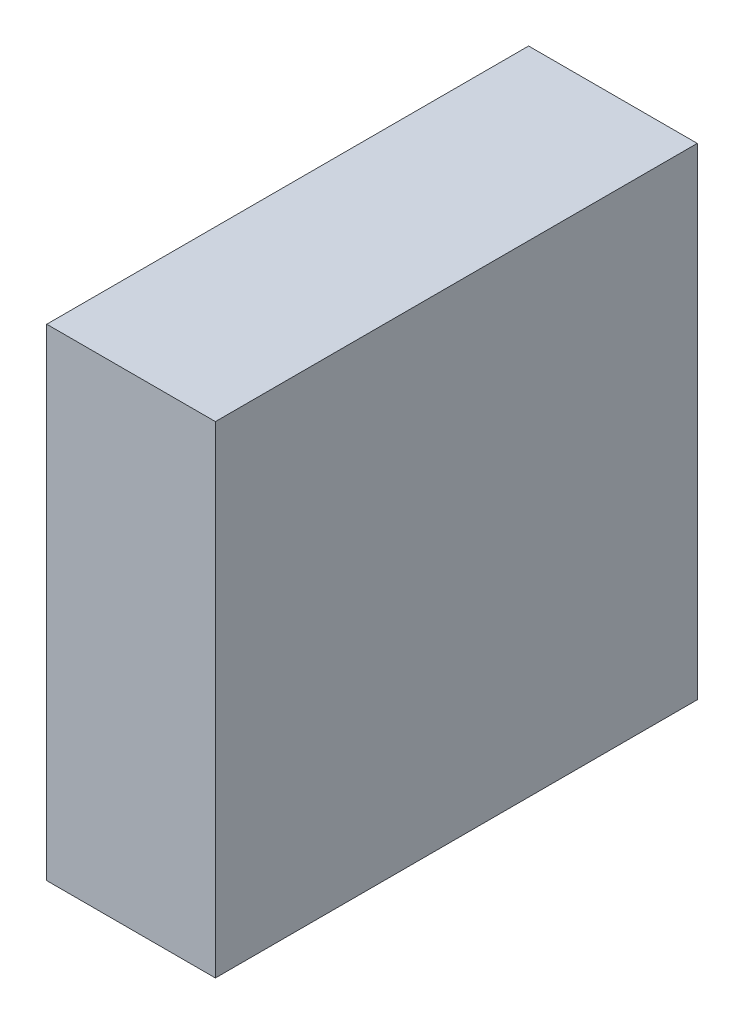
ISO-10303-21;
HEADER;
FILE_DESCRIPTION(('STEP AP214'),'2;1');
FILE_NAME('part.step','',(''),(''),'','','');
FILE_SCHEMA(('AUTOMOTIVE_DESIGN { 1 0 10303 214 1 1 1 1 }'));
ENDSEC;
DATA;
#1=APPLICATION_CONTEXT('core data for automotive mechanical design processes');
#2=APPLICATION_PROTOCOL_DEFINITION('international standard','automotive_design',2000,#1);
#3=PRODUCT_CONTEXT('',#1,'mechanical');
#4=PRODUCT('Part','Part','',(#3));
#5=PRODUCT_RELATED_PRODUCT_CATEGORY('part','',(#4));
#6=PRODUCT_DEFINITION_FORMATION('','',#4);
#7=PRODUCT_DEFINITION_CONTEXT('part definition',#1,'design');
#8=PRODUCT_DEFINITION('design','',#6,#7);
#9=PRODUCT_DEFINITION_SHAPE('','',#8);
#10=(LENGTH_UNIT() NAMED_UNIT(*) SI_UNIT(.MILLI.,.METRE.));
#11=(NAMED_UNIT(*) PLANE_ANGLE_UNIT() SI_UNIT($,.RADIAN.));
#12=(NAMED_UNIT(*) SI_UNIT($,.STERADIAN.) SOLID_ANGLE_UNIT());
#13=UNCERTAINTY_MEASURE_WITH_UNIT(LENGTH_MEASURE(1.E-05),#10,'distance_accuracy_value','');
#14=(GEOMETRIC_REPRESENTATION_CONTEXT(3) GLOBAL_UNCERTAINTY_ASSIGNED_CONTEXT((#13)) GLOBAL_UNIT_ASSIGNED_CONTEXT((#10,
#11,#12)) REPRESENTATION_CONTEXT('',''));
#15=CARTESIAN_POINT('',(0.,0.,0.));
#16=DIRECTION('',(0.,0.,1.));
#17=DIRECTION('',(1.,0.,0.));
#18=AXIS2_PLACEMENT_3D('',#15,#16,#17);
#19=CARTESIAN_POINT('',(88.9,0.,0.));
#20=DIRECTION('',(0.,0.,-1.));
#21=DIRECTION('',(-1.,0.,0.));
#22=AXIS2_PLACEMENT_3D('',#19,#20,#21);
#23=PLANE('',#22);
#24=DIRECTION('',(0.,-1.,0.));
#25=VECTOR('',#24,1.);
#26=CARTESIAN_POINT('',(0.,0.,0.));
#27=LINE('',#26,#25);
#28=CARTESIAN_POINT('',(0.,254.,0.));
#29=VERTEX_POINT('',#28);
#30=CARTESIAN_POINT('',(0.,0.,0.));
#31=VERTEX_POINT('',#30);
#32=EDGE_CURVE('E96',#29,#31,#27,.T.);
#33=ORIENTED_EDGE('',*,*,#32,.T.);
#34=DIRECTION('',(-1.,0.,0.));
#35=VECTOR('',#34,1.);
#36=CARTESIAN_POINT('',(88.9,0.,0.));
#37=LINE('',#36,#35);
#38=CARTESIAN_POINT('',(88.9,0.,0.));
#39=VERTEX_POINT('',#38);
#40=EDGE_CURVE('E11',#39,#31,#37,.T.);
#41=ORIENTED_EDGE('',*,*,#40,.F.);
#42=DIRECTION('',(0.,-1.,0.));
#43=VECTOR('',#42,1.);
#44=CARTESIAN_POINT('',(88.9,0.,0.));
#45=LINE('',#44,#43);
#46=CARTESIAN_POINT('',(88.9,254.,0.));
#47=VERTEX_POINT('',#46);
#48=EDGE_CURVE('E84',#47,#39,#45,.T.);
#49=ORIENTED_EDGE('',*,*,#48,.F.);
#50=DIRECTION('',(-1.,0.,0.));
#51=VECTOR('',#50,1.);
#52=CARTESIAN_POINT('',(88.9,254.,0.));
#53=LINE('',#52,#51);
#54=EDGE_CURVE('E92',#47,#29,#53,.T.);
#55=ORIENTED_EDGE('',*,*,#54,.T.);
#56=EDGE_LOOP('',(#33,#41,#49,#55));
#57=FACE_BOUND('',#56,.T.);
#58=ADVANCED_FACE('F33',(#57),#23,.F.);
#59=CARTESIAN_POINT('',(88.9,0.,0.));
#60=DIRECTION('',(0.,1.,0.));
#61=DIRECTION('',(0.,0.,1.));
#62=AXIS2_PLACEMENT_3D('',#59,#60,#61);
#63=PLANE('',#62);
#64=DIRECTION('',(0.,0.,-1.));
#65=VECTOR('',#64,1.);
#66=CARTESIAN_POINT('',(0.,0.,0.));
#67=LINE('',#66,#65);
#68=CARTESIAN_POINT('',(0.,0.,-254.));
#69=VERTEX_POINT('',#68);
#70=EDGE_CURVE('E88',#31,#69,#67,.T.);
#71=ORIENTED_EDGE('',*,*,#70,.T.);
#72=DIRECTION('',(-1.,0.,0.));
#73=VECTOR('',#72,1.);
#74=CARTESIAN_POINT('',(88.9,0.,-254.));
#75=LINE('',#74,#73);
#76=CARTESIAN_POINT('',(88.9,0.,-254.));
#77=VERTEX_POINT('',#76);
#78=EDGE_CURVE('E41',#77,#69,#75,.T.);
#79=ORIENTED_EDGE('',*,*,#78,.F.);
#80=DIRECTION('',(0.,0.,-1.));
#81=VECTOR('',#80,1.);
#82=CARTESIAN_POINT('',(88.9,0.,0.));
#83=LINE('',#82,#81);
#84=EDGE_CURVE('E79',#39,#77,#83,.T.);
#85=ORIENTED_EDGE('',*,*,#84,.F.);
#86=ORIENTED_EDGE('',*,*,#40,.T.);
#87=EDGE_LOOP('',(#71,#79,#85,#86));
#88=FACE_BOUND('',#87,.T.);
#89=ADVANCED_FACE('F87',(#88),#63,.F.);
#90=CARTESIAN_POINT('',(88.9,0.,-254.));
#91=DIRECTION('',(0.,0.,1.));
#92=DIRECTION('',(1.,0.,0.));
#93=AXIS2_PLACEMENT_3D('',#90,#91,#92);
#94=PLANE('',#93);
#95=DIRECTION('',(0.,1.,0.));
#96=VECTOR('',#95,1.);
#97=CARTESIAN_POINT('',(0.,0.,-254.));
#98=LINE('',#97,#96);
#99=CARTESIAN_POINT('',(0.,254.,-254.));
#100=VERTEX_POINT('',#99);
#101=EDGE_CURVE('E66',#69,#100,#98,.T.);
#102=ORIENTED_EDGE('',*,*,#101,.T.);
#103=DIRECTION('',(-1.,0.,0.));
#104=VECTOR('',#103,1.);
#105=CARTESIAN_POINT('',(88.9,254.,-254.));
#106=LINE('',#105,#104);
#107=CARTESIAN_POINT('',(88.9,254.,-254.));
#108=VERTEX_POINT('',#107);
#109=EDGE_CURVE('E89',#108,#100,#106,.T.);
#110=ORIENTED_EDGE('',*,*,#109,.F.);
#111=DIRECTION('',(0.,1.,0.));
#112=VECTOR('',#111,1.);
#113=CARTESIAN_POINT('',(88.9,0.,-254.));
#114=LINE('',#113,#112);
#115=EDGE_CURVE('E82',#77,#108,#114,.T.);
#116=ORIENTED_EDGE('',*,*,#115,.F.);
#117=ORIENTED_EDGE('',*,*,#78,.T.);
#118=EDGE_LOOP('',(#102,#110,#116,#117));
#119=FACE_BOUND('',#118,.T.);
#120=ADVANCED_FACE('F90',(#119),#94,.F.);
#121=CARTESIAN_POINT('',(88.9,254.,0.));
#122=DIRECTION('',(0.,-1.,0.));
#123=DIRECTION('',(0.,0.,-1.));
#124=AXIS2_PLACEMENT_3D('',#121,#122,#123);
#125=PLANE('',#124);
#126=DIRECTION('',(0.,0.,1.));
#127=VECTOR('',#126,1.);
#128=CARTESIAN_POINT('',(0.,254.,0.));
#129=LINE('',#128,#127);
#130=EDGE_CURVE('E72',#100,#29,#129,.T.);
#131=ORIENTED_EDGE('',*,*,#130,.T.);
#132=ORIENTED_EDGE('',*,*,#54,.F.);
#133=DIRECTION('',(0.,0.,1.));
#134=VECTOR('',#133,1.);
#135=CARTESIAN_POINT('',(88.9,254.,0.));
#136=LINE('',#135,#134);
#137=EDGE_CURVE('E49',#108,#47,#136,.T.);
#138=ORIENTED_EDGE('',*,*,#137,.F.);
#139=ORIENTED_EDGE('',*,*,#109,.T.);
#140=EDGE_LOOP('',(#131,#132,#138,#139));
#141=FACE_BOUND('',#140,.T.);
#142=ADVANCED_FACE('F103',(#141),#125,.F.);
#143=CARTESIAN_POINT('',(88.9,0.,0.));
#144=DIRECTION('',(-1.,0.,0.));
#145=DIRECTION('',(0.,0.,1.));
#146=AXIS2_PLACEMENT_3D('',#143,#144,#145);
#147=PLANE('',#146);
#148=ORIENTED_EDGE('',*,*,#48,.T.);
#149=ORIENTED_EDGE('',*,*,#84,.T.);
#150=ORIENTED_EDGE('',*,*,#115,.T.);
#151=ORIENTED_EDGE('',*,*,#137,.T.);
#152=EDGE_LOOP('',(#148,#149,#150,#151));
#153=FACE_BOUND('',#152,.T.);
#154=ADVANCED_FACE('F80',(#153),#147,.F.);
#155=CARTESIAN_POINT('',(0.,0.,0.));
#156=DIRECTION('',(-1.,0.,0.));
#157=DIRECTION('',(0.,0.,1.));
#158=AXIS2_PLACEMENT_3D('',#155,#156,#157);
#159=PLANE('',#158);
#160=ORIENTED_EDGE('',*,*,#32,.F.);
#161=ORIENTED_EDGE('',*,*,#130,.F.);
#162=ORIENTED_EDGE('',*,*,#101,.F.);
#163=ORIENTED_EDGE('',*,*,#70,.F.);
#164=EDGE_LOOP('',(#160,#161,#162,#163));
#165=FACE_BOUND('',#164,.T.);
#166=ADVANCED_FACE('F106',(#165),#159,.T.);
#167=CLOSED_SHELL('',(#58,#89,#120,#142,#154,#166));
#168=MANIFOLD_SOLID_BREP('B2',#167);
#169=ADVANCED_BREP_SHAPE_REPRESENTATION('',(#18,#168),#14);
#170=SHAPE_DEFINITION_REPRESENTATION(#9,#169);
ENDSEC;
END-ISO-10303-21;
